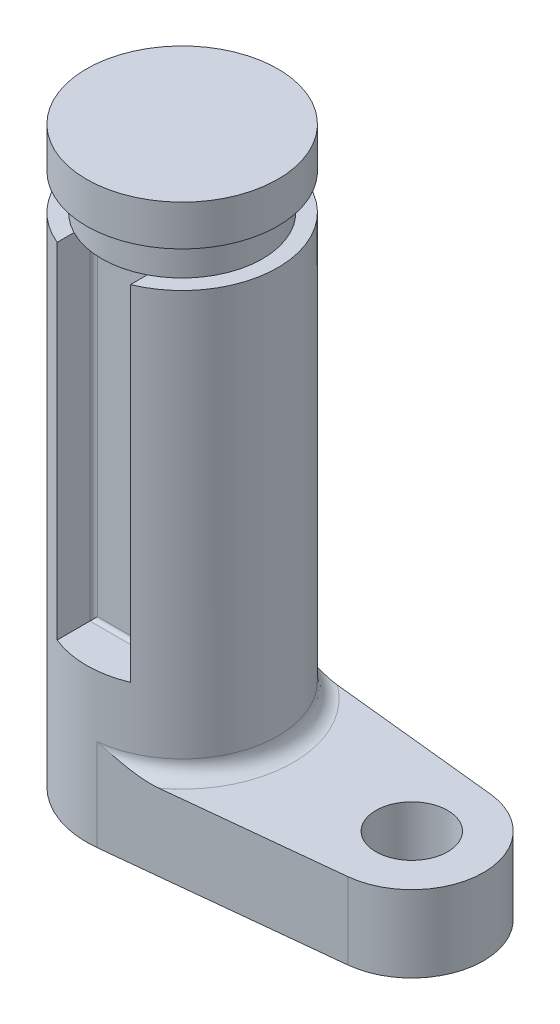
ISO-10303-21;
HEADER;
FILE_DESCRIPTION(('STEP AP214'),'2;1');
FILE_NAME('part.step','',(''),(''),'','','');
FILE_SCHEMA(('AUTOMOTIVE_DESIGN { 1 0 10303 214 1 1 1 1 }'));
ENDSEC;
DATA;
#1=APPLICATION_CONTEXT('core data for automotive mechanical design processes');
#2=APPLICATION_PROTOCOL_DEFINITION('international standard','automotive_design',2000,#1);
#3=PRODUCT_CONTEXT('',#1,'mechanical');
#4=PRODUCT('Part','Part','',(#3));
#5=PRODUCT_RELATED_PRODUCT_CATEGORY('part','',(#4));
#6=PRODUCT_DEFINITION_FORMATION('','',#4);
#7=PRODUCT_DEFINITION_CONTEXT('part definition',#1,'design');
#8=PRODUCT_DEFINITION('design','',#6,#7);
#9=PRODUCT_DEFINITION_SHAPE('','',#8);
#10=(LENGTH_UNIT() NAMED_UNIT(*) SI_UNIT(.MILLI.,.METRE.));
#11=(NAMED_UNIT(*) PLANE_ANGLE_UNIT() SI_UNIT($,.RADIAN.));
#12=(NAMED_UNIT(*) SI_UNIT($,.STERADIAN.) SOLID_ANGLE_UNIT());
#13=UNCERTAINTY_MEASURE_WITH_UNIT(LENGTH_MEASURE(1.E-05),#10,'distance_accuracy_value','');
#14=(GEOMETRIC_REPRESENTATION_CONTEXT(3) GLOBAL_UNCERTAINTY_ASSIGNED_CONTEXT((#13)) GLOBAL_UNIT_ASSIGNED_CONTEXT((#10,
#11,#12)) REPRESENTATION_CONTEXT('',''));
#15=CARTESIAN_POINT('',(0.,0.,0.));
#16=DIRECTION('',(0.,0.,1.));
#17=DIRECTION('',(1.,0.,0.));
#18=AXIS2_PLACEMENT_3D('',#15,#16,#17);
#19=CARTESIAN_POINT('',(0.,16.51,0.));
#20=DIRECTION('',(0.,-1.,0.));
#21=DIRECTION('',(0.,0.,-1.));
#22=AXIS2_PLACEMENT_3D('',#19,#20,#21);
#23=CYLINDRICAL_SURFACE('',#22,3.175);
#24=CARTESIAN_POINT('',(0.,0.508000000000002,0.));
#25=DIRECTION('',(0.,-1.,0.));
#26=DIRECTION('',(0.,0.,-1.));
#27=AXIS2_PLACEMENT_3D('',#24,#25,#26);
#28=CIRCLE('',#27,3.175);
#29=CARTESIAN_POINT('',(0.330729166666667,0.508000000000002,3.15772754022825));
#30=VERTEX_POINT('',#29);
#31=CARTESIAN_POINT('',(0.330729166666666,0.508000000000002,-3.15772754022825));
#32=VERTEX_POINT('',#31);
#33=EDGE_CURVE('E196',#30,#32,#28,.F.);
#34=ORIENTED_EDGE('',*,*,#33,.T.);
#35=DIRECTION('',(0.,1.,0.));
#36=VECTOR('',#35,1.);
#37=CARTESIAN_POINT('',(0.330729166666666,-2.54,-3.15772754022825));
#38=LINE('',#37,#36);
#39=CARTESIAN_POINT('',(0.330729166666666,-2.54,-3.15772754022825));
#40=VERTEX_POINT('',#39);
#41=EDGE_CURVE('E175',#40,#32,#38,.T.);
#42=ORIENTED_EDGE('',*,*,#41,.F.);
#43=CARTESIAN_POINT('',(0.,-2.54,0.));
#44=DIRECTION('',(0.,-1.,0.));
#45=DIRECTION('',(0.,0.,-1.));
#46=AXIS2_PLACEMENT_3D('',#43,#44,#45);
#47=CIRCLE('',#46,3.175);
#48=CARTESIAN_POINT('',(0.330729166666667,-2.54,3.15772754022825));
#49=VERTEX_POINT('',#48);
#50=EDGE_CURVE('E173',#49,#40,#47,.T.);
#51=ORIENTED_EDGE('',*,*,#50,.F.);
#52=DIRECTION('',(0.,1.,0.));
#53=VECTOR('',#52,1.);
#54=CARTESIAN_POINT('',(0.330729166666667,-2.54,3.15772754022825));
#55=LINE('',#54,#53);
#56=EDGE_CURVE('E186',#49,#30,#55,.T.);
#57=ORIENTED_EDGE('',*,*,#56,.T.);
#58=EDGE_LOOP('',(#34,#42,#51,#57));
#59=FACE_BOUND('',#58,.T.);
#60=CARTESIAN_POINT('',(0.,13.97,0.));
#61=DIRECTION('',(0.,1.,0.));
#62=DIRECTION('',(0.,0.,1.));
#63=AXIS2_PLACEMENT_3D('',#60,#61,#62);
#64=CIRCLE('',#63,3.175);
#65=CARTESIAN_POINT('',(1.216025,13.97,2.93290098697092));
#66=VERTEX_POINT('',#65);
#67=CARTESIAN_POINT('',(-1.216025,13.97,2.93290098697092));
#68=VERTEX_POINT('',#67);
#69=EDGE_CURVE('E153',#66,#68,#64,.T.);
#70=ORIENTED_EDGE('',*,*,#69,.F.);
#71=DIRECTION('',(0.,-1.,0.));
#72=VECTOR('',#71,1.);
#73=CARTESIAN_POINT('',(1.216025,16.51,2.93290098697092));
#74=LINE('',#73,#72);
#75=CARTESIAN_POINT('',(1.216025,2.54,2.93290098697092));
#76=VERTEX_POINT('',#75);
#77=EDGE_CURVE('E149',#76,#66,#74,.F.);
#78=ORIENTED_EDGE('',*,*,#77,.F.);
#79=CARTESIAN_POINT('',(0.,2.54,0.));
#80=DIRECTION('',(0.,-1.,0.));
#81=DIRECTION('',(0.,0.,-1.));
#82=AXIS2_PLACEMENT_3D('',#79,#80,#81);
#83=CIRCLE('',#82,3.175);
#84=CARTESIAN_POINT('',(-1.216025,2.54,2.93290098697092));
#85=VERTEX_POINT('',#84);
#86=EDGE_CURVE('E327',#76,#85,#83,.T.);
#87=ORIENTED_EDGE('',*,*,#86,.T.);
#88=DIRECTION('',(0.,-1.,0.));
#89=VECTOR('',#88,1.);
#90=CARTESIAN_POINT('',(-1.216025,16.51,2.93290098697092));
#91=LINE('',#90,#89);
#92=EDGE_CURVE('E329',#68,#85,#91,.T.);
#93=ORIENTED_EDGE('',*,*,#92,.F.);
#94=EDGE_LOOP('',(#70,#78,#87,#93));
#95=FACE_BOUND('',#94,.T.);
#96=ADVANCED_FACE('F38',(#59,#95),#23,.T.);
#97=CARTESIAN_POINT('',(0.,13.97,0.));
#98=DIRECTION('',(0.,-1.,0.));
#99=DIRECTION('',(0.,0.,-1.));
#100=AXIS2_PLACEMENT_3D('',#97,#98,#99);
#101=PLANE('',#100);
#102=CARTESIAN_POINT('',(0.,13.97,0.));
#103=DIRECTION('',(0.,-1.,0.));
#104=DIRECTION('',(0.,0.,-1.));
#105=AXIS2_PLACEMENT_3D('',#102,#103,#104);
#106=CIRCLE('',#105,2.667);
#107=CARTESIAN_POINT('',(-1.216025,13.97,2.37364112691346));
#108=VERTEX_POINT('',#107);
#109=CARTESIAN_POINT('',(1.216025,13.97,2.37364112691346));
#110=VERTEX_POINT('',#109);
#111=EDGE_CURVE('E12',#108,#110,#106,.F.);
#112=ORIENTED_EDGE('',*,*,#111,.F.);
#113=DIRECTION('',(0.,0.,1.));
#114=VECTOR('',#113,1.);
#115=CARTESIAN_POINT('',(-1.216025,13.97,4.14892598697092));
#116=LINE('',#115,#114);
#117=CARTESIAN_POINT('',(-1.216025,13.97,1.84387598697092));
#118=VERTEX_POINT('',#117);
#119=EDGE_CURVE('E150',#118,#108,#116,.T.);
#120=ORIENTED_EDGE('',*,*,#119,.F.);
#121=DIRECTION('',(-1.,0.,0.));
#122=VECTOR('',#121,1.);
#123=CARTESIAN_POINT('',(1.216025,13.97,1.84387598697092));
#124=LINE('',#123,#122);
#125=CARTESIAN_POINT('',(1.216025,13.97,1.84387598697092));
#126=VERTEX_POINT('',#125);
#127=EDGE_CURVE('E47',#118,#126,#124,.F.);
#128=ORIENTED_EDGE('',*,*,#127,.T.);
#129=DIRECTION('',(0.,0.,-1.));
#130=VECTOR('',#129,1.);
#131=CARTESIAN_POINT('',(1.216025,13.97,4.14892598697092));
#132=LINE('',#131,#130);
#133=EDGE_CURVE('E141',#110,#126,#132,.T.);
#134=ORIENTED_EDGE('',*,*,#133,.F.);
#135=EDGE_LOOP('',(#112,#120,#128,#134));
#136=FACE_BOUND('',#135,.T.);
#137=ADVANCED_FACE('F142',(#136),#101,.T.);
#138=CARTESIAN_POINT('',(0.330729166666666,-2.54,-3.15772754022825));
#139=DIRECTION('',(0.104166666666667,0.,-0.994559855190001));
#140=DIRECTION('',(-0.994559855190001,0.,-0.104166666666667));
#141=AXIS2_PLACEMENT_3D('',#138,#139,#140);
#142=PLANE('',#141);
#143=DIRECTION('',(-0.994559855190001,0.,-0.104166666666667));
#144=VECTOR('',#143,1.);
#145=CARTESIAN_POINT('',(0.330729166666666,0.,-3.15772754022825));
#146=LINE('',#145,#144);
#147=CARTESIAN_POINT('',(7.868046875,0.,-2.36829565517119));
#148=VERTEX_POINT('',#147);
#149=CARTESIAN_POINT('',(2.187086259537,0.,-2.96329929189484));
#150=VERTEX_POINT('',#149);
#151=EDGE_CURVE('E178',#148,#150,#146,.T.);
#152=ORIENTED_EDGE('',*,*,#151,.F.);
#153=DIRECTION('',(0.,1.,0.));
#154=VECTOR('',#153,1.);
#155=CARTESIAN_POINT('',(7.868046875,-2.54,-2.36829565517119));
#156=LINE('',#155,#154);
#157=CARTESIAN_POINT('',(7.868046875,-2.54,-2.36829565517119));
#158=VERTEX_POINT('',#157);
#159=EDGE_CURVE('E191',#158,#148,#156,.T.);
#160=ORIENTED_EDGE('',*,*,#159,.F.);
#161=DIRECTION('',(-0.994559855190001,0.,-0.104166666666667));
#162=VECTOR('',#161,1.);
#163=CARTESIAN_POINT('',(0.330729166666666,-2.54,-3.15772754022825));
#164=LINE('',#163,#162);
#165=EDGE_CURVE('E163',#158,#40,#164,.T.);
#166=ORIENTED_EDGE('',*,*,#165,.T.);
#167=ORIENTED_EDGE('',*,*,#41,.T.);
#168=CARTESIAN_POINT('',(2.187086259537,0.,-2.96329929189484));
#169=CARTESIAN_POINT('',(2.15056686158807,5.71728721606233E-06,-2.96712420392317));
#170=CARTESIAN_POINT('',(2.1140623702829,0.001021728846811,-2.97094755468258));
#171=CARTESIAN_POINT('',(2.04116663553422,0.00485117368516923,-2.97858239502262));
#172=CARTESIAN_POINT('',(2.00477533787398,0.00766354336837368,-2.98239389028172));
#173=CARTESIAN_POINT('',(1.89603592779688,0.0184425634130386,-2.99378286986291));
#174=CARTESIAN_POINT('',(1.82391608758523,0.0287536847308351,-3.00133644576503));
#175=CARTESIAN_POINT('',(1.68123692657486,0.0541431163066032,-3.01628015430875));
#176=CARTESIAN_POINT('',(1.61066934718975,0.0691765666242647,-3.02367115192536));
#177=CARTESIAN_POINT('',(1.47038970487554,0.103023101549809,-3.03836354340367));
#178=CARTESIAN_POINT('',(1.40067836576424,0.121839177901414,-3.04566486145527));
#179=CARTESIAN_POINT('',(1.16291227441502,0.191369163494789,-3.07056763734449));
#180=CARTESIAN_POINT('',(0.996948348791374,0.249183267367073,-3.08795010942891));
#181=CARTESIAN_POINT('',(0.667690648038677,0.372566088486403,-3.12243539151903));
#182=CARTESIAN_POINT('',(0.504403737261454,0.438151996716374,-3.1395374825769));
#183=CARTESIAN_POINT('',(0.337666824672936,0.505209760541807,-3.15700091457046));
#184=CARTESIAN_POINT('',(0.33419799865295,0.506604880917881,-3.15736422708691));
#185=CARTESIAN_POINT('',(0.330729166666666,0.508000000000002,-3.15772754022825));
#186=B_SPLINE_CURVE_WITH_KNOTS('',3,(#168,#169,#170,#171,#172,#173,#174,#175,#176,#177,#178,
#179,#180,#181,#182,#183,#184,#185),.UNSPECIFIED.,.F.,.F.,(4,2,2,2,2,2,2,2,4),(0.,
0.110120572144982,0.220176003983491,0.439667149666761,0.65713326198063,0.874772053488898,
1.40399836213702,1.93441795718017,1.94568738488306),.UNSPECIFIED.);
#187=EDGE_CURVE('E201',#32,#150,#186,.F.);
#188=ORIENTED_EDGE('',*,*,#187,.T.);
#189=EDGE_LOOP('',(#152,#160,#166,#167,#188));
#190=FACE_BOUND('',#189,.T.);
#191=ADVANCED_FACE('F214',(#190),#142,.T.);
#192=CARTESIAN_POINT('',(7.62,-2.54,0.));
#193=DIRECTION('',(0.,1.,0.));
#194=DIRECTION('',(0.,0.,1.));
#195=AXIS2_PLACEMENT_3D('',#192,#193,#194);
#196=CYLINDRICAL_SURFACE('',#195,2.38125);
#197=CARTESIAN_POINT('',(7.62,0.,0.));
#198=DIRECTION('',(0.,-1.,0.));
#199=DIRECTION('',(0.,0.,-1.));
#200=AXIS2_PLACEMENT_3D('',#197,#198,#199);
#201=CIRCLE('',#200,2.38125);
#202=CARTESIAN_POINT('',(7.868046875,0.,2.36829565517119));
#203=VERTEX_POINT('',#202);
#204=EDGE_CURVE('E181',#203,#148,#201,.F.);
#205=ORIENTED_EDGE('',*,*,#204,.F.);
#206=DIRECTION('',(0.,1.,0.));
#207=VECTOR('',#206,1.);
#208=CARTESIAN_POINT('',(7.868046875,-2.54,2.36829565517119));
#209=LINE('',#208,#207);
#210=CARTESIAN_POINT('',(7.868046875,-2.54,2.36829565517119));
#211=VERTEX_POINT('',#210);
#212=EDGE_CURVE('E188',#211,#203,#209,.T.);
#213=ORIENTED_EDGE('',*,*,#212,.F.);
#214=CARTESIAN_POINT('',(7.62,-2.54,0.));
#215=DIRECTION('',(0.,-1.,0.));
#216=DIRECTION('',(0.,0.,-1.));
#217=AXIS2_PLACEMENT_3D('',#214,#215,#216);
#218=CIRCLE('',#217,2.38125);
#219=EDGE_CURVE('E167',#211,#158,#218,.F.);
#220=ORIENTED_EDGE('',*,*,#219,.T.);
#221=ORIENTED_EDGE('',*,*,#159,.T.);
#222=EDGE_LOOP('',(#205,#213,#220,#221));
#223=FACE_BOUND('',#222,.T.);
#224=ADVANCED_FACE('F304',(#223),#196,.T.);
#225=CARTESIAN_POINT('',(0.330729166666667,-2.54,3.15772754022825));
#226=DIRECTION('',(0.104166666666667,0.,0.994559855190001));
#227=DIRECTION('',(0.994559855190001,0.,-0.104166666666667));
#228=AXIS2_PLACEMENT_3D('',#225,#226,#227);
#229=PLANE('',#228);
#230=DIRECTION('',(0.994559855190001,0.,-0.104166666666667));
#231=VECTOR('',#230,1.);
#232=CARTESIAN_POINT('',(0.330729166666667,0.,3.15772754022825));
#233=LINE('',#232,#231);
#234=CARTESIAN_POINT('',(2.187086259537,0.,2.96329929189484));
#235=VERTEX_POINT('',#234);
#236=EDGE_CURVE('E164',#235,#203,#233,.T.);
#237=ORIENTED_EDGE('',*,*,#236,.F.);
#238=CARTESIAN_POINT('',(2.187086259537,0.,2.96329929189484));
#239=CARTESIAN_POINT('',(2.1505668615881,5.71728721585923E-06,2.96712420392317));
#240=CARTESIAN_POINT('',(2.11406237028296,0.00102172884680917,2.97094755468258));
#241=CARTESIAN_POINT('',(2.04116663553435,0.0048511736851612,2.97858239502261));
#242=CARTESIAN_POINT('',(2.00477533787414,0.0076635433683611,2.9823938902817));
#243=CARTESIAN_POINT('',(1.89603592779711,0.0184425634130091,2.99378286986288));
#244=CARTESIAN_POINT('',(1.82391608758551,0.02875368473079,3.001336445765));
#245=CARTESIAN_POINT('',(1.68123692657513,0.0541431163065497,3.01628015430872));
#246=CARTESIAN_POINT('',(1.61066934718996,0.0691765666242257,3.02367115192534));
#247=CARTESIAN_POINT('',(1.47038970487564,0.103023101549772,3.03836354340366));
#248=CARTESIAN_POINT('',(1.40067836576427,0.121839177901364,3.04566486145526));
#249=CARTESIAN_POINT('',(1.16291227441504,0.191369163494879,3.07056763734448));
#250=CARTESIAN_POINT('',(0.996948348791544,0.249183267367609,3.08795010942889));
#251=CARTESIAN_POINT('',(0.667690648038434,0.372566088485889,3.12243539151906));
#252=CARTESIAN_POINT('',(0.504403737260638,0.438151996714359,3.139537482577));
#253=CARTESIAN_POINT('',(0.337666824672908,0.50520976054172,3.15700091457047));
#254=CARTESIAN_POINT('',(0.334197998652936,0.506604880917836,3.15736422708692));
#255=CARTESIAN_POINT('',(0.330729166666666,0.508000000000002,3.15772754022825));
#256=B_SPLINE_CURVE_WITH_KNOTS('',3,(#238,#239,#240,#241,#242,#243,#244,#245,#246,#247,#248,
#249,#250,#251,#252,#253,#254,#255),.UNSPECIFIED.,.F.,.F.,(4,2,2,2,2,2,2,2,4),(0.,
0.110120572144887,0.220176003983302,0.439667149666423,0.657133261980472,0.8747720534889,
1.40399836213708,1.93441795718016,1.94568738488306),.UNSPECIFIED.);
#257=EDGE_CURVE('E208',#235,#30,#256,.T.);
#258=ORIENTED_EDGE('',*,*,#257,.T.);
#259=ORIENTED_EDGE('',*,*,#56,.F.);
#260=DIRECTION('',(0.994559855190001,0.,-0.104166666666667));
#261=VECTOR('',#260,1.);
#262=CARTESIAN_POINT('',(0.330729166666667,-2.54,3.15772754022825));
#263=LINE('',#262,#261);
#264=EDGE_CURVE('E170',#49,#211,#263,.T.);
#265=ORIENTED_EDGE('',*,*,#264,.T.);
#266=ORIENTED_EDGE('',*,*,#212,.T.);
#267=EDGE_LOOP('',(#237,#258,#259,#265,#266));
#268=FACE_BOUND('',#267,.T.);
#269=ADVANCED_FACE('F301',(#268),#229,.T.);
#270=CARTESIAN_POINT('',(7.62,-2.54,0.));
#271=DIRECTION('',(0.,1.,0.));
#272=DIRECTION('',(0.,0.,1.));
#273=AXIS2_PLACEMENT_3D('',#270,#271,#272);
#274=CYLINDRICAL_SURFACE('',#273,1.190625);
#275=CARTESIAN_POINT('',(7.62,-2.54,0.));
#276=DIRECTION('',(0.,-1.,0.));
#277=DIRECTION('',(0.,0.,-1.));
#278=AXIS2_PLACEMENT_3D('',#275,#276,#277);
#279=CIRCLE('',#278,1.190625);
#280=CARTESIAN_POINT('',(7.62,-2.54,-1.190625));
#281=VERTEX_POINT('',#280);
#282=EDGE_CURVE('E160',#281,#281,#279,.T.);
#283=ORIENTED_EDGE('',*,*,#282,.T.);
#284=EDGE_LOOP('',(#283));
#285=FACE_BOUND('',#284,.T.);
#286=CARTESIAN_POINT('',(7.62,0.,0.));
#287=DIRECTION('',(0.,-1.,0.));
#288=DIRECTION('',(0.,0.,-1.));
#289=AXIS2_PLACEMENT_3D('',#286,#287,#288);
#290=CIRCLE('',#289,1.190625);
#291=CARTESIAN_POINT('',(7.62,0.,-1.190625));
#292=VERTEX_POINT('',#291);
#293=EDGE_CURVE('E155',#292,#292,#290,.T.);
#294=ORIENTED_EDGE('',*,*,#293,.F.);
#295=EDGE_LOOP('',(#294));
#296=FACE_BOUND('',#295,.T.);
#297=ADVANCED_FACE('F297',(#285,#296),#274,.F.);
#298=CARTESIAN_POINT('',(0.,-2.54,0.));
#299=DIRECTION('',(0.,-1.,0.));
#300=DIRECTION('',(0.,0.,-1.));
#301=AXIS2_PLACEMENT_3D('',#298,#299,#300);
#302=PLANE('',#301);
#303=ORIENTED_EDGE('',*,*,#282,.F.);
#304=EDGE_LOOP('',(#303));
#305=FACE_BOUND('',#304,.T.);
#306=ORIENTED_EDGE('',*,*,#165,.F.);
#307=ORIENTED_EDGE('',*,*,#219,.F.);
#308=ORIENTED_EDGE('',*,*,#264,.F.);
#309=ORIENTED_EDGE('',*,*,#50,.T.);
#310=EDGE_LOOP('',(#306,#307,#308,#309));
#311=FACE_BOUND('',#310,.T.);
#312=ADVANCED_FACE('F294',(#305,#311),#302,.T.);
#313=CARTESIAN_POINT('',(0.,0.,0.));
#314=DIRECTION('',(0.,-1.,0.));
#315=DIRECTION('',(0.,0.,-1.));
#316=AXIS2_PLACEMENT_3D('',#313,#314,#315);
#317=PLANE('',#316);
#318=ORIENTED_EDGE('',*,*,#151,.T.);
#319=CARTESIAN_POINT('',(0.,0.,0.));
#320=DIRECTION('',(0.,-1.,0.));
#321=DIRECTION('',(0.,0.,-1.));
#322=AXIS2_PLACEMENT_3D('',#319,#320,#321);
#323=CIRCLE('',#322,3.683);
#324=EDGE_CURVE('E199',#150,#235,#323,.T.);
#325=ORIENTED_EDGE('',*,*,#324,.T.);
#326=ORIENTED_EDGE('',*,*,#236,.T.);
#327=ORIENTED_EDGE('',*,*,#204,.T.);
#328=EDGE_LOOP('',(#318,#325,#326,#327));
#329=FACE_BOUND('',#328,.T.);
#330=ORIENTED_EDGE('',*,*,#293,.T.);
#331=EDGE_LOOP('',(#330));
#332=FACE_BOUND('',#331,.T.);
#333=ADVANCED_FACE('F223',(#329,#332),#317,.F.);
#334=CARTESIAN_POINT('',(0.,0.508000000000002,0.));
#335=DIRECTION('',(0.,-1.,0.));
#336=DIRECTION('',(0.,0.,-1.));
#337=AXIS2_PLACEMENT_3D('',#334,#335,#336);
#338=TOROIDAL_SURFACE('',#337,3.683,0.508);
#339=ORIENTED_EDGE('',*,*,#257,.F.);
#340=ORIENTED_EDGE('',*,*,#324,.F.);
#341=ORIENTED_EDGE('',*,*,#187,.F.);
#342=ORIENTED_EDGE('',*,*,#33,.F.);
#343=EDGE_LOOP('',(#339,#340,#341,#342));
#344=FACE_BOUND('',#343,.T.);
#345=ADVANCED_FACE('F218',(#344),#338,.F.);
#346=CARTESIAN_POINT('',(1.216025,13.97,4.14892598697092));
#347=DIRECTION('',(-1.,0.,0.));
#348=DIRECTION('',(0.,0.,1.));
#349=AXIS2_PLACEMENT_3D('',#346,#347,#348);
#350=PLANE('',#349);
#351=EDGE_CURVE('E134',#66,#110,#132,.T.);
#352=ORIENTED_EDGE('',*,*,#351,.T.);
#353=ORIENTED_EDGE('',*,*,#133,.T.);
#354=DIRECTION('',(0.,-1.,0.));
#355=VECTOR('',#354,1.);
#356=CARTESIAN_POINT('',(1.216025,2.54,1.84387598697092));
#357=LINE('',#356,#355);
#358=CARTESIAN_POINT('',(1.216025,2.54,1.84387598697092));
#359=VERTEX_POINT('',#358);
#360=EDGE_CURVE('E60',#126,#359,#357,.T.);
#361=ORIENTED_EDGE('',*,*,#360,.T.);
#362=DIRECTION('',(0.,0.,-1.));
#363=VECTOR('',#362,1.);
#364=CARTESIAN_POINT('',(1.216025,2.54,4.14892598697092));
#365=LINE('',#364,#363);
#366=EDGE_CURVE('E156',#76,#359,#365,.T.);
#367=ORIENTED_EDGE('',*,*,#366,.F.);
#368=ORIENTED_EDGE('',*,*,#77,.T.);
#369=EDGE_LOOP('',(#352,#353,#361,#367,#368));
#370=FACE_BOUND('',#369,.T.);
#371=ADVANCED_FACE('F147',(#370),#350,.T.);
#372=CARTESIAN_POINT('',(-1.216025,13.97,4.14892598697092));
#373=DIRECTION('',(1.,0.,0.));
#374=DIRECTION('',(0.,0.,-1.));
#375=AXIS2_PLACEMENT_3D('',#372,#373,#374);
#376=PLANE('',#375);
#377=DIRECTION('',(0.,0.,1.));
#378=VECTOR('',#377,1.);
#379=CARTESIAN_POINT('',(-1.216025,2.54,4.14892598697092));
#380=LINE('',#379,#378);
#381=CARTESIAN_POINT('',(-1.216025,2.54,1.84387598697092));
#382=VERTEX_POINT('',#381);
#383=EDGE_CURVE('E144',#382,#85,#380,.T.);
#384=ORIENTED_EDGE('',*,*,#383,.F.);
#385=DIRECTION('',(0.,-1.,0.));
#386=VECTOR('',#385,1.);
#387=CARTESIAN_POINT('',(-1.216025,13.97,1.84387598697092));
#388=LINE('',#387,#386);
#389=EDGE_CURVE('E344',#382,#118,#388,.F.);
#390=ORIENTED_EDGE('',*,*,#389,.T.);
#391=ORIENTED_EDGE('',*,*,#119,.T.);
#392=EDGE_CURVE('E137',#108,#68,#116,.T.);
#393=ORIENTED_EDGE('',*,*,#392,.T.);
#394=ORIENTED_EDGE('',*,*,#92,.T.);
#395=EDGE_LOOP('',(#384,#390,#391,#393,#394));
#396=FACE_BOUND('',#395,.T.);
#397=ADVANCED_FACE('F284',(#396),#376,.T.);
#398=CARTESIAN_POINT('',(0.,2.54,0.));
#399=DIRECTION('',(0.,-1.,0.));
#400=DIRECTION('',(0.,0.,-1.));
#401=AXIS2_PLACEMENT_3D('',#398,#399,#400);
#402=PLANE('',#401);
#403=ORIENTED_EDGE('',*,*,#366,.T.);
#404=DIRECTION('',(-1.,0.,0.));
#405=VECTOR('',#404,1.);
#406=CARTESIAN_POINT('',(0.,2.54,1.84387598697092));
#407=LINE('',#406,#405);
#408=EDGE_CURVE('E348',#359,#382,#407,.T.);
#409=ORIENTED_EDGE('',*,*,#408,.T.);
#410=ORIENTED_EDGE('',*,*,#383,.T.);
#411=ORIENTED_EDGE('',*,*,#86,.F.);
#412=EDGE_LOOP('',(#403,#409,#410,#411));
#413=FACE_BOUND('',#412,.T.);
#414=ADVANCED_FACE('F281',(#413),#402,.F.);
#415=CARTESIAN_POINT('',(-1.216025,13.97,1.71687598697092));
#416=DIRECTION('',(0.,0.,1.));
#417=DIRECTION('',(1.,0.,0.));
#418=AXIS2_PLACEMENT_3D('',#415,#416,#417);
#419=PLANE('',#418);
#420=DIRECTION('',(0.,-1.,0.));
#421=VECTOR('',#420,1.);
#422=CARTESIAN_POINT('',(-1.089025,2.54,1.71687598697092));
#423=LINE('',#422,#421);
#424=CARTESIAN_POINT('',(-1.089025,13.843,1.71687598697092));
#425=VERTEX_POINT('',#424);
#426=CARTESIAN_POINT('',(-1.089025,2.667,1.71687598697092));
#427=VERTEX_POINT('',#426);
#428=EDGE_CURVE('E339',#425,#427,#423,.T.);
#429=ORIENTED_EDGE('',*,*,#428,.T.);
#430=DIRECTION('',(-1.,0.,0.));
#431=VECTOR('',#430,1.);
#432=CARTESIAN_POINT('',(-1.216025,2.667,1.71687598697092));
#433=LINE('',#432,#431);
#434=CARTESIAN_POINT('',(1.089025,2.667,1.71687598697092));
#435=VERTEX_POINT('',#434);
#436=EDGE_CURVE('E342',#427,#435,#433,.F.);
#437=ORIENTED_EDGE('',*,*,#436,.T.);
#438=DIRECTION('',(0.,-1.,0.));
#439=VECTOR('',#438,1.);
#440=CARTESIAN_POINT('',(1.089025,13.97,1.71687598697092));
#441=LINE('',#440,#439);
#442=CARTESIAN_POINT('',(1.089025,13.843,1.71687598697092));
#443=VERTEX_POINT('',#442);
#444=EDGE_CURVE('E337',#435,#443,#441,.F.);
#445=ORIENTED_EDGE('',*,*,#444,.T.);
#446=DIRECTION('',(-1.,0.,0.));
#447=VECTOR('',#446,1.);
#448=CARTESIAN_POINT('',(-1.216025,13.843,1.71687598697092));
#449=LINE('',#448,#447);
#450=EDGE_CURVE('E335',#443,#425,#449,.T.);
#451=ORIENTED_EDGE('',*,*,#450,.T.);
#452=EDGE_LOOP('',(#429,#437,#445,#451));
#453=FACE_BOUND('',#452,.T.);
#454=ADVANCED_FACE('F242',(#453),#419,.T.);
#455=CARTESIAN_POINT('',(1.089025,13.97,1.84387598697092));
#456=DIRECTION('',(0.,1.,0.));
#457=DIRECTION('',(0.,0.,1.));
#458=AXIS2_PLACEMENT_3D('',#455,#456,#457);
#459=CYLINDRICAL_SURFACE('',#458,0.127);
#460=CARTESIAN_POINT('',(1.089025,2.667,1.84387598697092));
#461=DIRECTION('',(0.707106781186547,0.707106781186547,0.));
#462=DIRECTION('',(-0.707106781186547,0.707106781186547,0.));
#463=AXIS2_PLACEMENT_3D('',#460,#461,#462);
#464=ELLIPSE('',#463,0.179605122421383,0.127);
#465=EDGE_CURVE('E352',#359,#435,#464,.T.);
#466=ORIENTED_EDGE('',*,*,#465,.F.);
#467=ORIENTED_EDGE('',*,*,#360,.F.);
#468=CARTESIAN_POINT('',(1.089025,13.843,1.84387598697092));
#469=DIRECTION('',(-0.707106781186547,0.707106781186547,0.));
#470=DIRECTION('',(0.707106781186547,0.707106781186547,0.));
#471=AXIS2_PLACEMENT_3D('',#468,#469,#470);
#472=ELLIPSE('',#471,0.179605122421383,0.127);
#473=EDGE_CURVE('E158',#443,#126,#472,.F.);
#474=ORIENTED_EDGE('',*,*,#473,.F.);
#475=ORIENTED_EDGE('',*,*,#444,.F.);
#476=EDGE_LOOP('',(#466,#467,#474,#475));
#477=FACE_BOUND('',#476,.T.);
#478=ADVANCED_FACE('F40',(#477),#459,.F.);
#479=CARTESIAN_POINT('',(-1.216025,13.843,1.84387598697092));
#480=DIRECTION('',(1.,0.,0.));
#481=DIRECTION('',(0.,0.,-1.));
#482=AXIS2_PLACEMENT_3D('',#479,#480,#481);
#483=CYLINDRICAL_SURFACE('',#482,0.127);
#484=ORIENTED_EDGE('',*,*,#473,.T.);
#485=ORIENTED_EDGE('',*,*,#127,.F.);
#486=CARTESIAN_POINT('',(-1.089025,13.843,1.84387598697092));
#487=DIRECTION('',(0.707106781186547,0.707106781186547,0.));
#488=DIRECTION('',(-0.707106781186547,0.707106781186547,0.));
#489=AXIS2_PLACEMENT_3D('',#486,#487,#488);
#490=ELLIPSE('',#489,0.179605122421383,0.127);
#491=EDGE_CURVE('E265',#425,#118,#490,.T.);
#492=ORIENTED_EDGE('',*,*,#491,.F.);
#493=ORIENTED_EDGE('',*,*,#450,.F.);
#494=EDGE_LOOP('',(#484,#485,#492,#493));
#495=FACE_BOUND('',#494,.T.);
#496=ADVANCED_FACE('F235',(#495),#483,.F.);
#497=CARTESIAN_POINT('',(0.,2.667,1.84387598697092));
#498=DIRECTION('',(-1.,0.,0.));
#499=DIRECTION('',(0.,0.,1.));
#500=AXIS2_PLACEMENT_3D('',#497,#498,#499);
#501=CYLINDRICAL_SURFACE('',#500,0.127);
#502=ORIENTED_EDGE('',*,*,#465,.T.);
#503=ORIENTED_EDGE('',*,*,#436,.F.);
#504=CARTESIAN_POINT('',(-1.089025,2.667,1.84387598697092));
#505=DIRECTION('',(-0.707106781186547,0.707106781186547,0.));
#506=DIRECTION('',(0.707106781186547,0.707106781186547,0.));
#507=AXIS2_PLACEMENT_3D('',#504,#505,#506);
#508=ELLIPSE('',#507,0.179605122421383,0.127);
#509=EDGE_CURVE('E264',#382,#427,#508,.F.);
#510=ORIENTED_EDGE('',*,*,#509,.F.);
#511=ORIENTED_EDGE('',*,*,#408,.F.);
#512=EDGE_LOOP('',(#502,#503,#510,#511));
#513=FACE_BOUND('',#512,.T.);
#514=ADVANCED_FACE('F232',(#513),#501,.F.);
#515=CARTESIAN_POINT('',(-1.089025,13.97,1.84387598697092));
#516=DIRECTION('',(0.,1.,0.));
#517=DIRECTION('',(0.,0.,1.));
#518=AXIS2_PLACEMENT_3D('',#515,#516,#517);
#519=CYLINDRICAL_SURFACE('',#518,0.127);
#520=ORIENTED_EDGE('',*,*,#491,.T.);
#521=ORIENTED_EDGE('',*,*,#389,.F.);
#522=ORIENTED_EDGE('',*,*,#509,.T.);
#523=ORIENTED_EDGE('',*,*,#428,.F.);
#524=EDGE_LOOP('',(#520,#521,#522,#523));
#525=FACE_BOUND('',#524,.T.);
#526=ADVANCED_FACE('F227',(#525),#519,.F.);
#527=CARTESIAN_POINT('',(3.413125,15.1638,0.));
#528=DIRECTION('',(0.,1.,0.));
#529=DIRECTION('',(0.,0.,1.));
#530=AXIS2_PLACEMENT_3D('',#527,#528,#529);
#531=PLANE('',#530);
#532=CARTESIAN_POINT('',(0.,15.1638,0.));
#533=DIRECTION('',(0.,1.,0.));
#534=DIRECTION('',(0.,0.,1.));
#535=AXIS2_PLACEMENT_3D('',#532,#533,#534);
#536=CIRCLE('',#535,2.667);
#537=CARTESIAN_POINT('',(0.,15.1638,2.667));
#538=VERTEX_POINT('',#537);
#539=EDGE_CURVE('E138',#538,#538,#536,.T.);
#540=ORIENTED_EDGE('',*,*,#539,.T.);
#541=EDGE_LOOP('',(#540));
#542=FACE_BOUND('',#541,.T.);
#543=CARTESIAN_POINT('',(0.,15.1638,0.));
#544=DIRECTION('',(0.,1.,0.));
#545=DIRECTION('',(0.,0.,1.));
#546=AXIS2_PLACEMENT_3D('',#543,#544,#545);
#547=CIRCLE('',#546,3.175);
#548=CARTESIAN_POINT('',(0.,15.1638,3.175));
#549=VERTEX_POINT('',#548);
#550=EDGE_CURVE('E42',#549,#549,#547,.T.);
#551=ORIENTED_EDGE('',*,*,#550,.F.);
#552=EDGE_LOOP('',(#551));
#553=FACE_BOUND('',#552,.T.);
#554=ADVANCED_FACE('F231',(#542,#553),#531,.F.);
#555=CARTESIAN_POINT('',(3.413125,13.97,0.));
#556=DIRECTION('',(0.,1.,0.));
#557=DIRECTION('',(0.,0.,1.));
#558=AXIS2_PLACEMENT_3D('',#555,#556,#557);
#559=PLANE('',#558);
#560=ORIENTED_EDGE('',*,*,#69,.T.);
#561=ORIENTED_EDGE('',*,*,#392,.F.);
#562=CARTESIAN_POINT('',(0.,13.97,0.));
#563=DIRECTION('',(0.,1.,0.));
#564=DIRECTION('',(0.,0.,1.));
#565=AXIS2_PLACEMENT_3D('',#562,#563,#564);
#566=CIRCLE('',#565,2.667);
#567=EDGE_CURVE('E52',#110,#108,#566,.T.);
#568=ORIENTED_EDGE('',*,*,#567,.F.);
#569=ORIENTED_EDGE('',*,*,#351,.F.);
#570=EDGE_LOOP('',(#560,#561,#568,#569));
#571=FACE_BOUND('',#570,.T.);
#572=ADVANCED_FACE('F132',(#571),#559,.T.);
#573=CARTESIAN_POINT('',(0.,15.1638,0.));
#574=DIRECTION('',(0.,-1.,0.));
#575=DIRECTION('',(0.,0.,-1.));
#576=AXIS2_PLACEMENT_3D('',#573,#574,#575);
#577=CYLINDRICAL_SURFACE('',#576,2.667);
#578=ORIENTED_EDGE('',*,*,#539,.F.);
#579=EDGE_LOOP('',(#578));
#580=FACE_BOUND('',#579,.T.);
#581=ORIENTED_EDGE('',*,*,#567,.T.);
#582=ORIENTED_EDGE('',*,*,#111,.T.);
#583=EDGE_LOOP('',(#581,#582));
#584=FACE_BOUND('',#583,.T.);
#585=ADVANCED_FACE('F126',(#580,#584),#577,.T.);
#586=CARTESIAN_POINT('',(0.,16.51,0.));
#587=DIRECTION('',(0.,1.,0.));
#588=DIRECTION('',(0.,0.,1.));
#589=AXIS2_PLACEMENT_3D('',#586,#587,#588);
#590=PLANE('',#589);
#591=CARTESIAN_POINT('',(0.,16.51,0.));
#592=DIRECTION('',(0.,1.,0.));
#593=DIRECTION('',(0.,0.,1.));
#594=AXIS2_PLACEMENT_3D('',#591,#592,#593);
#595=CIRCLE('',#594,3.175);
#596=CARTESIAN_POINT('',(0.,16.51,3.175));
#597=VERTEX_POINT('',#596);
#598=EDGE_CURVE('E193',#597,#597,#595,.T.);
#599=ORIENTED_EDGE('',*,*,#598,.T.);
#600=EDGE_LOOP('',(#599));
#601=FACE_BOUND('',#600,.T.);
#602=ADVANCED_FACE('F253',(#601),#590,.T.);
#603=ORIENTED_EDGE('',*,*,#550,.T.);
#604=EDGE_LOOP('',(#603));
#605=FACE_BOUND('',#604,.T.);
#606=ORIENTED_EDGE('',*,*,#598,.F.);
#607=EDGE_LOOP('',(#606));
#608=FACE_BOUND('',#607,.T.);
#609=ADVANCED_FACE('F225',(#605,#608),#23,.T.);
#610=CLOSED_SHELL('',(#96,#137,#191,#224,#269,#297,#312,#333,#345,#371,#397,#414,#454,#478,#496,
#514,#526,#554,#572,#585,#602,#609));
#611=MANIFOLD_SOLID_BREP('B2',#610);
#612=ADVANCED_BREP_SHAPE_REPRESENTATION('',(#18,#611),#14);
#613=SHAPE_DEFINITION_REPRESENTATION(#9,#612);
ENDSEC;
END-ISO-10303-21;
